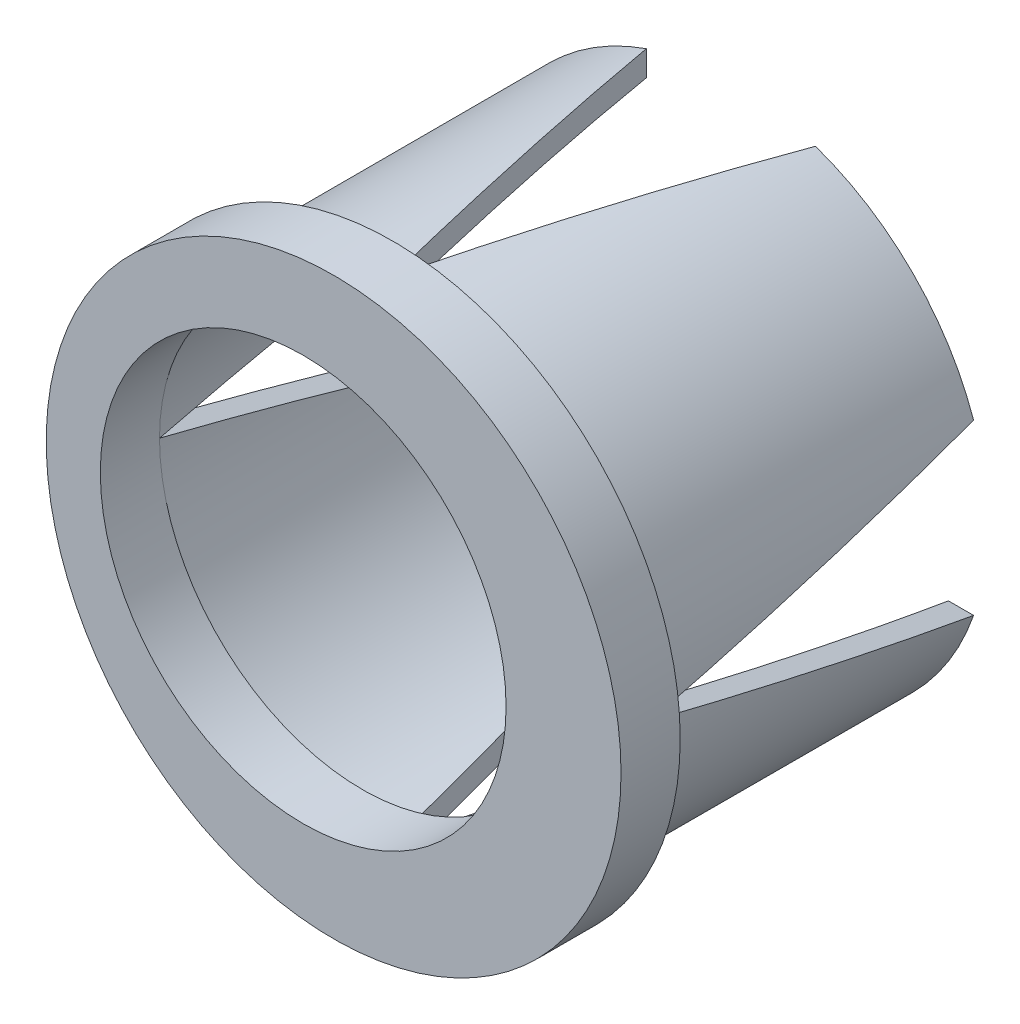
ISO-10303-21;
HEADER;
FILE_DESCRIPTION(('STEP AP214'),'2;1');
FILE_NAME('part.step','',(''),(''),'','','');
FILE_SCHEMA(('AUTOMOTIVE_DESIGN { 1 0 10303 214 1 1 1 1 }'));
ENDSEC;
DATA;
#1=APPLICATION_CONTEXT('core data for automotive mechanical design processes');
#2=APPLICATION_PROTOCOL_DEFINITION('international standard','automotive_design',2000,#1);
#3=PRODUCT_CONTEXT('',#1,'mechanical');
#4=PRODUCT('Part','Part','',(#3));
#5=PRODUCT_RELATED_PRODUCT_CATEGORY('part','',(#4));
#6=PRODUCT_DEFINITION_FORMATION('','',#4);
#7=PRODUCT_DEFINITION_CONTEXT('part definition',#1,'design');
#8=PRODUCT_DEFINITION('design','',#6,#7);
#9=PRODUCT_DEFINITION_SHAPE('','',#8);
#10=(LENGTH_UNIT() NAMED_UNIT(*) SI_UNIT(.MILLI.,.METRE.));
#11=(NAMED_UNIT(*) PLANE_ANGLE_UNIT() SI_UNIT($,.RADIAN.));
#12=(NAMED_UNIT(*) SI_UNIT($,.STERADIAN.) SOLID_ANGLE_UNIT());
#13=UNCERTAINTY_MEASURE_WITH_UNIT(LENGTH_MEASURE(1.E-05),#10,'distance_accuracy_value','');
#14=(GEOMETRIC_REPRESENTATION_CONTEXT(3) GLOBAL_UNCERTAINTY_ASSIGNED_CONTEXT((#13)) GLOBAL_UNIT_ASSIGNED_CONTEXT((#10,
#11,#12)) REPRESENTATION_CONTEXT('',''));
#15=CARTESIAN_POINT('',(0.,0.,0.));
#16=DIRECTION('',(0.,0.,1.));
#17=DIRECTION('',(1.,0.,0.));
#18=AXIS2_PLACEMENT_3D('',#15,#16,#17);
#19=CARTESIAN_POINT('',(0.,0.,-12.7));
#20=DIRECTION('',(0.,0.,1.));
#21=DIRECTION('',(1.,0.,0.));
#22=AXIS2_PLACEMENT_3D('',#19,#20,#21);
#23=CYLINDRICAL_SURFACE('',#22,8.763);
#24=CARTESIAN_POINT('',(0.,0.,0.));
#25=DIRECTION('',(0.,0.970142500145332,-0.242535625036333));
#26=DIRECTION('',(0.,0.242535625036333,0.970142500145332));
#27=AXIS2_PLACEMENT_3D('',#24,#25,#26);
#28=ELLIPSE('',#27,36.1307745972876,8.763);
#29=CARTESIAN_POINT('',(-8.763,0.,0.));
#30=VERTEX_POINT('',#29);
#31=CARTESIAN_POINT('',(-8.16759107693327,-3.175,-12.7));
#32=VERTEX_POINT('',#31);
#33=EDGE_CURVE('E239',#30,#32,#28,.F.);
#34=ORIENTED_EDGE('',*,*,#33,.F.);
#35=CARTESIAN_POINT('',(0.,0.,0.));
#36=DIRECTION('',(0.,0.,1.));
#37=DIRECTION('',(1.,0.,0.));
#38=AXIS2_PLACEMENT_3D('',#35,#36,#37);
#39=CIRCLE('',#38,8.763);
#40=CARTESIAN_POINT('',(0.,-8.763,0.));
#41=VERTEX_POINT('',#40);
#42=EDGE_CURVE('E208',#30,#41,#39,.T.);
#43=ORIENTED_EDGE('',*,*,#42,.T.);
#44=CARTESIAN_POINT('',(0.,0.,0.));
#45=DIRECTION('',(0.970142500145332,0.,-0.242535625036333));
#46=DIRECTION('',(0.242535625036333,0.,0.970142500145332));
#47=AXIS2_PLACEMENT_3D('',#44,#45,#46);
#48=ELLIPSE('',#47,36.1307745972876,8.763);
#49=CARTESIAN_POINT('',(-3.175,-8.16759107693327,-12.7));
#50=VERTEX_POINT('',#49);
#51=EDGE_CURVE('E227',#50,#41,#48,.F.);
#52=ORIENTED_EDGE('',*,*,#51,.F.);
#53=CARTESIAN_POINT('',(0.,0.,-12.7));
#54=DIRECTION('',(0.,0.,1.));
#55=DIRECTION('',(1.,0.,0.));
#56=AXIS2_PLACEMENT_3D('',#53,#54,#55);
#57=CIRCLE('',#56,8.763);
#58=EDGE_CURVE('E165',#32,#50,#57,.T.);
#59=ORIENTED_EDGE('',*,*,#58,.F.);
#60=EDGE_LOOP('',(#34,#43,#52,#59));
#61=FACE_BOUND('',#60,.T.);
#62=ADVANCED_FACE('F45',(#61),#23,.F.);
#63=CARTESIAN_POINT('',(0.,0.,0.));
#64=DIRECTION('',(0.,-0.970142500145332,-0.242535625036333));
#65=DIRECTION('',(0.,-0.242535625036333,0.970142500145332));
#66=AXIS2_PLACEMENT_3D('',#63,#64,#65);
#67=ELLIPSE('',#66,36.1307745972876,8.763);
#68=CARTESIAN_POINT('',(-8.16759107693327,3.175,-12.7));
#69=VERTEX_POINT('',#68);
#70=EDGE_CURVE('E247',#69,#30,#67,.F.);
#71=ORIENTED_EDGE('',*,*,#70,.F.);
#72=CARTESIAN_POINT('',(-3.175,8.16759107693327,-12.7));
#73=VERTEX_POINT('',#72);
#74=EDGE_CURVE('E159',#73,#69,#57,.T.);
#75=ORIENTED_EDGE('',*,*,#74,.F.);
#76=CARTESIAN_POINT('',(0.,8.763,0.));
#77=VERTEX_POINT('',#76);
#78=EDGE_CURVE('E221',#77,#73,#48,.F.);
#79=ORIENTED_EDGE('',*,*,#78,.F.);
#80=EDGE_CURVE('E215',#77,#30,#39,.T.);
#81=ORIENTED_EDGE('',*,*,#80,.T.);
#82=EDGE_LOOP('',(#71,#75,#79,#81));
#83=FACE_BOUND('',#82,.T.);
#84=ADVANCED_FACE('F301',(#83),#23,.F.);
#85=CARTESIAN_POINT('',(0.,0.,0.));
#86=DIRECTION('',(0.,0.970142500145332,-0.242535625036333));
#87=DIRECTION('',(0.,0.242535625036333,0.970142500145332));
#88=AXIS2_PLACEMENT_3D('',#85,#86,#87);
#89=ELLIPSE('',#88,36.1307745972876,8.763);
#90=CARTESIAN_POINT('',(8.16759107693327,-3.175,-12.7));
#91=VERTEX_POINT('',#90);
#92=CARTESIAN_POINT('',(8.763,0.,0.));
#93=VERTEX_POINT('',#92);
#94=EDGE_CURVE('E241',#91,#93,#89,.F.);
#95=ORIENTED_EDGE('',*,*,#94,.F.);
#96=CARTESIAN_POINT('',(3.175,-8.16759107693327,-12.7));
#97=VERTEX_POINT('',#96);
#98=EDGE_CURVE('E167',#97,#91,#57,.T.);
#99=ORIENTED_EDGE('',*,*,#98,.F.);
#100=CARTESIAN_POINT('',(0.,0.,0.));
#101=DIRECTION('',(-0.970142500145332,0.,-0.242535625036333));
#102=DIRECTION('',(-0.242535625036333,0.,0.970142500145332));
#103=AXIS2_PLACEMENT_3D('',#100,#101,#102);
#104=ELLIPSE('',#103,36.1307745972876,8.763);
#105=EDGE_CURVE('E192',#41,#97,#104,.F.);
#106=ORIENTED_EDGE('',*,*,#105,.F.);
#107=EDGE_CURVE('E211',#41,#93,#39,.T.);
#108=ORIENTED_EDGE('',*,*,#107,.T.);
#109=EDGE_LOOP('',(#95,#99,#106,#108));
#110=FACE_BOUND('',#109,.T.);
#111=ADVANCED_FACE('F264',(#110),#23,.F.);
#112=CARTESIAN_POINT('',(0.,0.,0.));
#113=DIRECTION('',(0.,-0.970142500145332,-0.242535625036333));
#114=DIRECTION('',(0.,-0.242535625036333,0.970142500145332));
#115=AXIS2_PLACEMENT_3D('',#112,#113,#114);
#116=ELLIPSE('',#115,36.1307745972876,8.763);
#117=CARTESIAN_POINT('',(8.16759107693327,3.175,-12.7));
#118=VERTEX_POINT('',#117);
#119=EDGE_CURVE('E68',#93,#118,#116,.F.);
#120=ORIENTED_EDGE('',*,*,#119,.F.);
#121=EDGE_CURVE('E212',#93,#77,#39,.T.);
#122=ORIENTED_EDGE('',*,*,#121,.T.);
#123=CARTESIAN_POINT('',(3.175,8.16759107693327,-12.7));
#124=VERTEX_POINT('',#123);
#125=EDGE_CURVE('E232',#124,#77,#104,.F.);
#126=ORIENTED_EDGE('',*,*,#125,.F.);
#127=EDGE_CURVE('E168',#118,#124,#57,.T.);
#128=ORIENTED_EDGE('',*,*,#127,.F.);
#129=EDGE_LOOP('',(#120,#122,#126,#128));
#130=FACE_BOUND('',#129,.T.);
#131=ADVANCED_FACE('F257',(#130),#23,.F.);
#132=CARTESIAN_POINT('',(0.,0.,-12.7));
#133=DIRECTION('',(0.,0.,1.));
#134=DIRECTION('',(1.,0.,0.));
#135=AXIS2_PLACEMENT_3D('',#132,#133,#134);
#136=CYLINDRICAL_SURFACE('',#135,9.652);
#137=CARTESIAN_POINT('',(0.,0.,0.));
#138=DIRECTION('',(0.,0.,1.));
#139=DIRECTION('',(1.,0.,0.));
#140=AXIS2_PLACEMENT_3D('',#137,#138,#139);
#141=CIRCLE('',#140,9.652);
#142=CARTESIAN_POINT('',(-9.652,0.,0.));
#143=VERTEX_POINT('',#142);
#144=CARTESIAN_POINT('',(0.,-9.652,0.));
#145=VERTEX_POINT('',#144);
#146=EDGE_CURVE('E202',#143,#145,#141,.T.);
#147=ORIENTED_EDGE('',*,*,#146,.F.);
#148=CARTESIAN_POINT('',(0.,0.,0.));
#149=DIRECTION('',(0.,0.970142500145332,-0.242535625036333));
#150=DIRECTION('',(0.,0.242535625036333,0.970142500145332));
#151=AXIS2_PLACEMENT_3D('',#148,#149,#150);
#152=ELLIPSE('',#151,39.7962154984617,9.652);
#153=CARTESIAN_POINT('',(-9.11484936792704,-3.175,-12.7));
#154=VERTEX_POINT('',#153);
#155=EDGE_CURVE('E181',#143,#154,#152,.F.);
#156=ORIENTED_EDGE('',*,*,#155,.T.);
#157=CARTESIAN_POINT('',(0.,0.,-12.7));
#158=DIRECTION('',(0.,0.,1.));
#159=DIRECTION('',(1.,0.,0.));
#160=AXIS2_PLACEMENT_3D('',#157,#158,#159);
#161=CIRCLE('',#160,9.652);
#162=CARTESIAN_POINT('',(-3.175,-9.11484936792704,-12.7));
#163=VERTEX_POINT('',#162);
#164=EDGE_CURVE('E162',#154,#163,#161,.T.);
#165=ORIENTED_EDGE('',*,*,#164,.T.);
#166=CARTESIAN_POINT('',(0.,0.,0.));
#167=DIRECTION('',(0.970142500145332,0.,-0.242535625036333));
#168=DIRECTION('',(0.242535625036333,0.,0.970142500145332));
#169=AXIS2_PLACEMENT_3D('',#166,#167,#168);
#170=ELLIPSE('',#169,39.7962154984617,9.652);
#171=EDGE_CURVE('E179',#163,#145,#170,.F.);
#172=ORIENTED_EDGE('',*,*,#171,.T.);
#173=EDGE_LOOP('',(#147,#156,#165,#172));
#174=FACE_BOUND('',#173,.T.);
#175=ADVANCED_FACE('F178',(#174),#136,.T.);
#176=CARTESIAN_POINT('',(-3.175,9.11484936792704,-12.7));
#177=VERTEX_POINT('',#176);
#178=CARTESIAN_POINT('',(-9.11484936792704,3.175,-12.7));
#179=VERTEX_POINT('',#178);
#180=EDGE_CURVE('E161',#177,#179,#161,.T.);
#181=ORIENTED_EDGE('',*,*,#180,.T.);
#182=CARTESIAN_POINT('',(0.,0.,0.));
#183=DIRECTION('',(0.,-0.970142500145332,-0.242535625036333));
#184=DIRECTION('',(0.,-0.242535625036333,0.970142500145332));
#185=AXIS2_PLACEMENT_3D('',#182,#183,#184);
#186=ELLIPSE('',#185,39.7962154984617,9.652);
#187=EDGE_CURVE('E60',#179,#143,#186,.F.);
#188=ORIENTED_EDGE('',*,*,#187,.T.);
#189=CARTESIAN_POINT('',(0.,9.652,0.));
#190=VERTEX_POINT('',#189);
#191=EDGE_CURVE('E200',#190,#143,#141,.T.);
#192=ORIENTED_EDGE('',*,*,#191,.F.);
#193=EDGE_CURVE('E191',#190,#177,#170,.F.);
#194=ORIENTED_EDGE('',*,*,#193,.T.);
#195=EDGE_LOOP('',(#181,#188,#192,#194));
#196=FACE_BOUND('',#195,.T.);
#197=ADVANCED_FACE('F312',(#196),#136,.T.);
#198=CARTESIAN_POINT('',(3.175,-9.11484936792704,-12.7));
#199=VERTEX_POINT('',#198);
#200=CARTESIAN_POINT('',(9.11484936792704,-3.175,-12.7));
#201=VERTEX_POINT('',#200);
#202=EDGE_CURVE('E158',#199,#201,#161,.T.);
#203=ORIENTED_EDGE('',*,*,#202,.T.);
#204=CARTESIAN_POINT('',(0.,0.,0.));
#205=DIRECTION('',(0.,0.970142500145332,-0.242535625036333));
#206=DIRECTION('',(0.,0.242535625036333,0.970142500145332));
#207=AXIS2_PLACEMENT_3D('',#204,#205,#206);
#208=ELLIPSE('',#207,39.7962154984617,9.652);
#209=CARTESIAN_POINT('',(9.652,0.,0.));
#210=VERTEX_POINT('',#209);
#211=EDGE_CURVE('E244',#201,#210,#208,.F.);
#212=ORIENTED_EDGE('',*,*,#211,.T.);
#213=EDGE_CURVE('E204',#145,#210,#141,.T.);
#214=ORIENTED_EDGE('',*,*,#213,.F.);
#215=CARTESIAN_POINT('',(0.,0.,0.));
#216=DIRECTION('',(-0.970142500145332,0.,-0.242535625036333));
#217=DIRECTION('',(-0.242535625036333,0.,0.970142500145332));
#218=AXIS2_PLACEMENT_3D('',#215,#216,#217);
#219=ELLIPSE('',#218,39.7962154984617,9.652);
#220=EDGE_CURVE('E234',#145,#199,#219,.F.);
#221=ORIENTED_EDGE('',*,*,#220,.T.);
#222=EDGE_LOOP('',(#203,#212,#214,#221));
#223=FACE_BOUND('',#222,.T.);
#224=ADVANCED_FACE('F427',(#223),#136,.T.);
#225=EDGE_CURVE('E150',#210,#190,#141,.T.);
#226=ORIENTED_EDGE('',*,*,#225,.F.);
#227=CARTESIAN_POINT('',(0.,0.,0.));
#228=DIRECTION('',(0.,-0.970142500145332,-0.242535625036333));
#229=DIRECTION('',(0.,-0.242535625036333,0.970142500145332));
#230=AXIS2_PLACEMENT_3D('',#227,#228,#229);
#231=ELLIPSE('',#230,39.7962154984617,9.652);
#232=CARTESIAN_POINT('',(9.11484936792704,3.175,-12.7));
#233=VERTEX_POINT('',#232);
#234=EDGE_CURVE('E136',#210,#233,#231,.F.);
#235=ORIENTED_EDGE('',*,*,#234,.T.);
#236=CARTESIAN_POINT('',(3.175,9.11484936792704,-12.7));
#237=VERTEX_POINT('',#236);
#238=EDGE_CURVE('E148',#233,#237,#161,.T.);
#239=ORIENTED_EDGE('',*,*,#238,.T.);
#240=EDGE_CURVE('E235',#237,#190,#219,.F.);
#241=ORIENTED_EDGE('',*,*,#240,.T.);
#242=EDGE_LOOP('',(#226,#235,#239,#241));
#243=FACE_BOUND('',#242,.T.);
#244=ADVANCED_FACE('F146',(#243),#136,.T.);
#245=CARTESIAN_POINT('',(0.,0.,-12.7));
#246=DIRECTION('',(0.,0.,1.));
#247=DIRECTION('',(1.,0.,0.));
#248=AXIS2_PLACEMENT_3D('',#245,#246,#247);
#249=PLANE('',#248);
#250=DIRECTION('',(-1.,0.,0.));
#251=VECTOR('',#250,1.);
#252=CARTESIAN_POINT('',(12.7,-3.175,-12.7));
#253=LINE('',#252,#251);
#254=EDGE_CURVE('E141',#32,#154,#253,.T.);
#255=ORIENTED_EDGE('',*,*,#254,.F.);
#256=ORIENTED_EDGE('',*,*,#58,.T.);
#257=DIRECTION('',(0.,1.,0.));
#258=VECTOR('',#257,1.);
#259=CARTESIAN_POINT('',(-3.175,0.,-12.7));
#260=LINE('',#259,#258);
#261=EDGE_CURVE('E12',#163,#50,#260,.T.);
#262=ORIENTED_EDGE('',*,*,#261,.F.);
#263=ORIENTED_EDGE('',*,*,#164,.F.);
#264=EDGE_LOOP('',(#255,#256,#262,#263));
#265=FACE_BOUND('',#264,.T.);
#266=ADVANCED_FACE('F194',(#265),#249,.F.);
#267=DIRECTION('',(-1.,0.,0.));
#268=VECTOR('',#267,1.);
#269=CARTESIAN_POINT('',(12.7,3.175,-12.7));
#270=LINE('',#269,#268);
#271=EDGE_CURVE('E142',#69,#179,#270,.T.);
#272=ORIENTED_EDGE('',*,*,#271,.T.);
#273=ORIENTED_EDGE('',*,*,#180,.F.);
#274=EDGE_CURVE('E49',#73,#177,#260,.T.);
#275=ORIENTED_EDGE('',*,*,#274,.F.);
#276=ORIENTED_EDGE('',*,*,#74,.T.);
#277=EDGE_LOOP('',(#272,#273,#275,#276));
#278=FACE_BOUND('',#277,.T.);
#279=ADVANCED_FACE('F404',(#278),#249,.F.);
#280=EDGE_CURVE('E152',#201,#91,#253,.T.);
#281=ORIENTED_EDGE('',*,*,#280,.F.);
#282=ORIENTED_EDGE('',*,*,#202,.F.);
#283=DIRECTION('',(0.,-1.,0.));
#284=VECTOR('',#283,1.);
#285=CARTESIAN_POINT('',(3.175,0.,-12.7));
#286=LINE('',#285,#284);
#287=EDGE_CURVE('E270',#97,#199,#286,.T.);
#288=ORIENTED_EDGE('',*,*,#287,.F.);
#289=ORIENTED_EDGE('',*,*,#98,.T.);
#290=EDGE_LOOP('',(#281,#282,#288,#289));
#291=FACE_BOUND('',#290,.T.);
#292=ADVANCED_FACE('F275',(#291),#249,.F.);
#293=EDGE_CURVE('E133',#233,#118,#270,.T.);
#294=ORIENTED_EDGE('',*,*,#293,.T.);
#295=ORIENTED_EDGE('',*,*,#127,.T.);
#296=EDGE_CURVE('E157',#237,#124,#286,.T.);
#297=ORIENTED_EDGE('',*,*,#296,.F.);
#298=ORIENTED_EDGE('',*,*,#238,.F.);
#299=EDGE_LOOP('',(#294,#295,#297,#298));
#300=FACE_BOUND('',#299,.T.);
#301=ADVANCED_FACE('F155',(#300),#249,.F.);
#302=CARTESIAN_POINT('',(0.,0.,0.));
#303=DIRECTION('',(0.,0.,1.));
#304=DIRECTION('',(1.,0.,0.));
#305=AXIS2_PLACEMENT_3D('',#302,#303,#304);
#306=PLANE('',#305);
#307=CARTESIAN_POINT('',(-1.143,0.,0.));
#308=DIRECTION('',(0.,0.,1.));
#309=DIRECTION('',(1.,0.,0.));
#310=AXIS2_PLACEMENT_3D('',#307,#308,#309);
#311=CIRCLE('',#310,7.62);
#312=EDGE_CURVE('E171',#30,#30,#311,.T.);
#313=ORIENTED_EDGE('',*,*,#312,.T.);
#314=ORIENTED_EDGE('',*,*,#80,.F.);
#315=ORIENTED_EDGE('',*,*,#121,.F.);
#316=ORIENTED_EDGE('',*,*,#107,.F.);
#317=ORIENTED_EDGE('',*,*,#42,.F.);
#318=EDGE_LOOP('',(#313,#314,#315,#316,#317));
#319=FACE_BOUND('',#318,.T.);
#320=ADVANCED_FACE('F260',(#319),#306,.F.);
#321=CARTESIAN_POINT('',(0.,0.,2.2225));
#322=DIRECTION('',(0.,0.,1.));
#323=DIRECTION('',(1.,0.,0.));
#324=AXIS2_PLACEMENT_3D('',#321,#322,#323);
#325=PLANE('',#324);
#326=CARTESIAN_POINT('',(0.,0.,2.2225));
#327=DIRECTION('',(0.,0.,1.));
#328=DIRECTION('',(1.,0.,0.));
#329=AXIS2_PLACEMENT_3D('',#326,#327,#328);
#330=CIRCLE('',#329,10.795);
#331=CARTESIAN_POINT('',(10.795,0.,2.2225));
#332=VERTEX_POINT('',#331);
#333=EDGE_CURVE('E276',#332,#332,#330,.T.);
#334=ORIENTED_EDGE('',*,*,#333,.T.);
#335=EDGE_LOOP('',(#334));
#336=FACE_BOUND('',#335,.T.);
#337=CARTESIAN_POINT('',(-1.143,0.,2.2225));
#338=DIRECTION('',(0.,0.,1.));
#339=DIRECTION('',(1.,0.,0.));
#340=AXIS2_PLACEMENT_3D('',#337,#338,#339);
#341=CIRCLE('',#340,7.62);
#342=CARTESIAN_POINT('',(6.477,0.,2.2225));
#343=VERTEX_POINT('',#342);
#344=EDGE_CURVE('E282',#343,#343,#341,.T.);
#345=ORIENTED_EDGE('',*,*,#344,.F.);
#346=EDGE_LOOP('',(#345));
#347=FACE_BOUND('',#346,.T.);
#348=ADVANCED_FACE('F290',(#336,#347),#325,.T.);
#349=ORIENTED_EDGE('',*,*,#191,.T.);
#350=ORIENTED_EDGE('',*,*,#146,.T.);
#351=ORIENTED_EDGE('',*,*,#213,.T.);
#352=ORIENTED_EDGE('',*,*,#225,.T.);
#353=EDGE_LOOP('',(#349,#350,#351,#352));
#354=FACE_BOUND('',#353,.T.);
#355=CARTESIAN_POINT('',(0.,0.,0.));
#356=DIRECTION('',(0.,0.,1.));
#357=DIRECTION('',(1.,0.,0.));
#358=AXIS2_PLACEMENT_3D('',#355,#356,#357);
#359=CIRCLE('',#358,10.795);
#360=CARTESIAN_POINT('',(10.795,0.,0.));
#361=VERTEX_POINT('',#360);
#362=EDGE_CURVE('E278',#361,#361,#359,.T.);
#363=ORIENTED_EDGE('',*,*,#362,.F.);
#364=EDGE_LOOP('',(#363));
#365=FACE_BOUND('',#364,.T.);
#366=ADVANCED_FACE('F292',(#354,#365),#306,.F.);
#367=CARTESIAN_POINT('',(0.,0.,2.2225));
#368=DIRECTION('',(0.,0.,-1.));
#369=DIRECTION('',(-1.,0.,0.));
#370=AXIS2_PLACEMENT_3D('',#367,#368,#369);
#371=CYLINDRICAL_SURFACE('',#370,10.795);
#372=ORIENTED_EDGE('',*,*,#333,.F.);
#373=EDGE_LOOP('',(#372));
#374=FACE_BOUND('',#373,.T.);
#375=ORIENTED_EDGE('',*,*,#362,.T.);
#376=EDGE_LOOP('',(#375));
#377=FACE_BOUND('',#376,.T.);
#378=ADVANCED_FACE('F47',(#374,#377),#371,.T.);
#379=CARTESIAN_POINT('',(-1.143,0.,2.2225));
#380=DIRECTION('',(0.,0.,-1.));
#381=DIRECTION('',(-1.,0.,0.));
#382=AXIS2_PLACEMENT_3D('',#379,#380,#381);
#383=CYLINDRICAL_SURFACE('',#382,7.62);
#384=ORIENTED_EDGE('',*,*,#344,.T.);
#385=EDGE_LOOP('',(#384));
#386=FACE_BOUND('',#385,.T.);
#387=ORIENTED_EDGE('',*,*,#312,.F.);
#388=EDGE_LOOP('',(#387));
#389=FACE_BOUND('',#388,.T.);
#390=ADVANCED_FACE('F287',(#386,#389),#383,.F.);
#391=CARTESIAN_POINT('',(0.,12.7,0.));
#392=DIRECTION('',(-0.970142500145332,0.,-0.242535625036333));
#393=DIRECTION('',(-0.242535625036333,0.,0.970142500145332));
#394=AXIS2_PLACEMENT_3D('',#391,#392,#393);
#395=PLANE('',#394);
#396=ORIENTED_EDGE('',*,*,#105,.T.);
#397=ORIENTED_EDGE('',*,*,#287,.T.);
#398=ORIENTED_EDGE('',*,*,#220,.F.);
#399=DIRECTION('',(0.,-1.,0.));
#400=VECTOR('',#399,1.);
#401=CARTESIAN_POINT('',(0.,12.7,0.));
#402=LINE('',#401,#400);
#403=EDGE_CURVE('E190',#41,#145,#402,.T.);
#404=ORIENTED_EDGE('',*,*,#403,.F.);
#405=EDGE_LOOP('',(#396,#397,#398,#404));
#406=FACE_BOUND('',#405,.T.);
#407=ADVANCED_FACE('F268',(#406),#395,.T.);
#408=CARTESIAN_POINT('',(0.,12.7,0.));
#409=DIRECTION('',(0.970142500145332,0.,-0.242535625036333));
#410=DIRECTION('',(-0.242535625036333,0.,-0.970142500145332));
#411=AXIS2_PLACEMENT_3D('',#408,#409,#410);
#412=PLANE('',#411);
#413=ORIENTED_EDGE('',*,*,#51,.T.);
#414=ORIENTED_EDGE('',*,*,#403,.T.);
#415=ORIENTED_EDGE('',*,*,#171,.F.);
#416=ORIENTED_EDGE('',*,*,#261,.T.);
#417=EDGE_LOOP('',(#413,#414,#415,#416));
#418=FACE_BOUND('',#417,.T.);
#419=ADVANCED_FACE('F187',(#418),#412,.T.);
#420=ORIENTED_EDGE('',*,*,#78,.T.);
#421=ORIENTED_EDGE('',*,*,#274,.T.);
#422=ORIENTED_EDGE('',*,*,#193,.F.);
#423=EDGE_CURVE('E237',#190,#77,#402,.T.);
#424=ORIENTED_EDGE('',*,*,#423,.T.);
#425=EDGE_LOOP('',(#420,#421,#422,#424));
#426=FACE_BOUND('',#425,.T.);
#427=ADVANCED_FACE('F334',(#426),#412,.T.);
#428=ORIENTED_EDGE('',*,*,#125,.T.);
#429=ORIENTED_EDGE('',*,*,#423,.F.);
#430=ORIENTED_EDGE('',*,*,#240,.F.);
#431=ORIENTED_EDGE('',*,*,#296,.T.);
#432=EDGE_LOOP('',(#428,#429,#430,#431));
#433=FACE_BOUND('',#432,.T.);
#434=ADVANCED_FACE('F329',(#433),#395,.T.);
#435=CARTESIAN_POINT('',(12.7,0.,0.));
#436=DIRECTION('',(0.,-0.970142500145332,-0.242535625036333));
#437=DIRECTION('',(0.,0.242535625036333,-0.970142500145332));
#438=AXIS2_PLACEMENT_3D('',#435,#436,#437);
#439=PLANE('',#438);
#440=ORIENTED_EDGE('',*,*,#119,.T.);
#441=ORIENTED_EDGE('',*,*,#293,.F.);
#442=ORIENTED_EDGE('',*,*,#234,.F.);
#443=DIRECTION('',(-1.,0.,0.));
#444=VECTOR('',#443,1.);
#445=CARTESIAN_POINT('',(12.7,0.,0.));
#446=LINE('',#445,#444);
#447=EDGE_CURVE('E253',#210,#93,#446,.T.);
#448=ORIENTED_EDGE('',*,*,#447,.T.);
#449=EDGE_LOOP('',(#440,#441,#442,#448));
#450=FACE_BOUND('',#449,.T.);
#451=ADVANCED_FACE('F135',(#450),#439,.T.);
#452=CARTESIAN_POINT('',(12.7,-3.175,-12.7));
#453=DIRECTION('',(0.,0.970142500145332,-0.242535625036333));
#454=DIRECTION('',(0.,0.242535625036333,0.970142500145332));
#455=AXIS2_PLACEMENT_3D('',#452,#453,#454);
#456=PLANE('',#455);
#457=ORIENTED_EDGE('',*,*,#94,.T.);
#458=ORIENTED_EDGE('',*,*,#447,.F.);
#459=ORIENTED_EDGE('',*,*,#211,.F.);
#460=ORIENTED_EDGE('',*,*,#280,.T.);
#461=EDGE_LOOP('',(#457,#458,#459,#460));
#462=FACE_BOUND('',#461,.T.);
#463=ADVANCED_FACE('F463',(#462),#456,.T.);
#464=ORIENTED_EDGE('',*,*,#33,.T.);
#465=ORIENTED_EDGE('',*,*,#254,.T.);
#466=ORIENTED_EDGE('',*,*,#155,.F.);
#467=EDGE_CURVE('E254',#30,#143,#446,.T.);
#468=ORIENTED_EDGE('',*,*,#467,.F.);
#469=EDGE_LOOP('',(#464,#465,#466,#468));
#470=FACE_BOUND('',#469,.T.);
#471=ADVANCED_FACE('F459',(#470),#456,.T.);
#472=ORIENTED_EDGE('',*,*,#70,.T.);
#473=ORIENTED_EDGE('',*,*,#467,.T.);
#474=ORIENTED_EDGE('',*,*,#187,.F.);
#475=ORIENTED_EDGE('',*,*,#271,.F.);
#476=EDGE_LOOP('',(#472,#473,#474,#475));
#477=FACE_BOUND('',#476,.T.);
#478=ADVANCED_FACE('F462',(#477),#439,.T.);
#479=CLOSED_SHELL('',(#62,#84,#111,#131,#175,#197,#224,#244,#266,#279,#292,#301,#320,#348,#366,
#378,#390,#407,#419,#427,#434,#451,#463,#471,#478));
#480=MANIFOLD_SOLID_BREP('B2',#479);
#481=ADVANCED_BREP_SHAPE_REPRESENTATION('',(#18,#480),#14);
#482=SHAPE_DEFINITION_REPRESENTATION(#9,#481);
ENDSEC;
END-ISO-10303-21;
